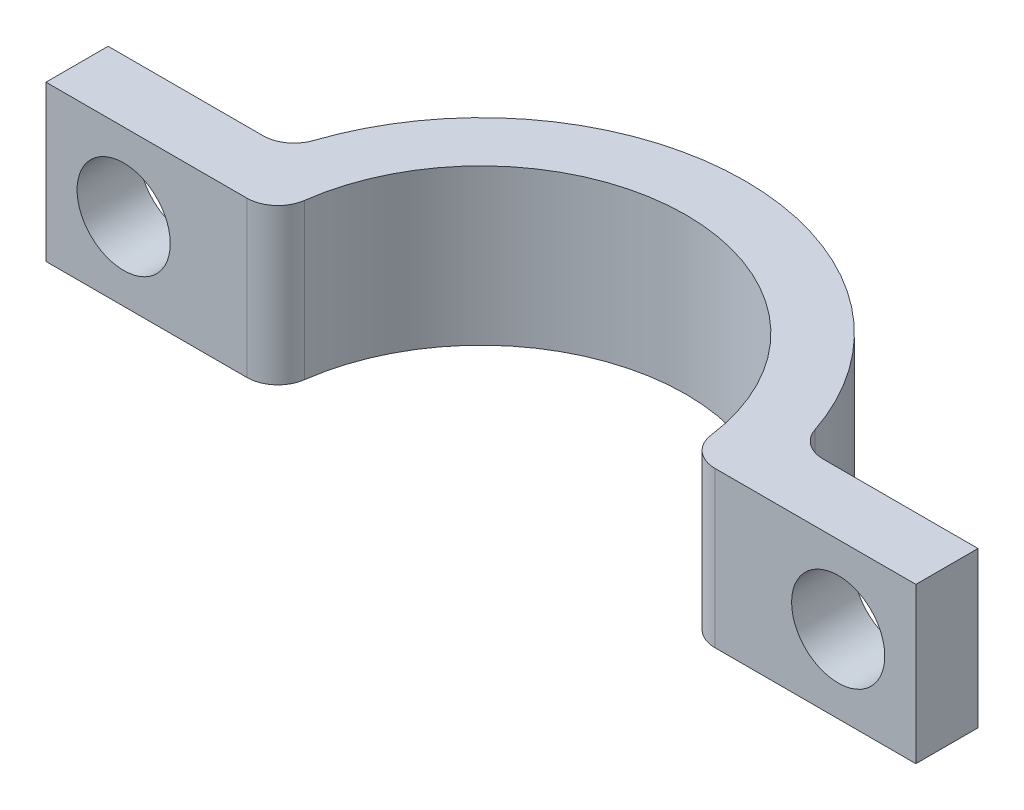
ISO-10303-21;
HEADER;
FILE_DESCRIPTION(('STEP AP214'),'2;1');
FILE_NAME('part.step','',(''),(''),'','','');
FILE_SCHEMA(('AUTOMOTIVE_DESIGN { 1 0 10303 214 1 1 1 1 }'));
ENDSEC;
DATA;
#1=APPLICATION_CONTEXT('core data for automotive mechanical design processes');
#2=APPLICATION_PROTOCOL_DEFINITION('international standard','automotive_design',2000,#1);
#3=PRODUCT_CONTEXT('',#1,'mechanical');
#4=PRODUCT('Part','Part','',(#3));
#5=PRODUCT_RELATED_PRODUCT_CATEGORY('part','',(#4));
#6=PRODUCT_DEFINITION_FORMATION('','',#4);
#7=PRODUCT_DEFINITION_CONTEXT('part definition',#1,'design');
#8=PRODUCT_DEFINITION('design','',#6,#7);
#9=PRODUCT_DEFINITION_SHAPE('','',#8);
#10=(LENGTH_UNIT() NAMED_UNIT(*) SI_UNIT(.MILLI.,.METRE.));
#11=(NAMED_UNIT(*) PLANE_ANGLE_UNIT() SI_UNIT($,.RADIAN.));
#12=(NAMED_UNIT(*) SI_UNIT($,.STERADIAN.) SOLID_ANGLE_UNIT());
#13=UNCERTAINTY_MEASURE_WITH_UNIT(LENGTH_MEASURE(1.E-05),#10,'distance_accuracy_value','');
#14=(GEOMETRIC_REPRESENTATION_CONTEXT(3) GLOBAL_UNCERTAINTY_ASSIGNED_CONTEXT((#13)) GLOBAL_UNIT_ASSIGNED_CONTEXT((#10,
#11,#12)) REPRESENTATION_CONTEXT('',''));
#15=CARTESIAN_POINT('',(0.,0.,0.));
#16=DIRECTION('',(0.,0.,1.));
#17=DIRECTION('',(1.,0.,0.));
#18=AXIS2_PLACEMENT_3D('',#15,#16,#17);
#19=CARTESIAN_POINT('',(0.,5.,0.));
#20=DIRECTION('',(0.,-1.,0.));
#21=DIRECTION('',(0.,0.,-1.));
#22=AXIS2_PLACEMENT_3D('',#19,#20,#21);
#23=CYLINDRICAL_SURFACE('',#22,6.6);
#24=CARTESIAN_POINT('',(0.,5.,0.));
#25=DIRECTION('',(0.,1.,0.));
#26=DIRECTION('',(0.,0.,1.));
#27=AXIS2_PLACEMENT_3D('',#24,#25,#26);
#28=CIRCLE('',#27,6.6);
#29=CARTESIAN_POINT('',(6.5426175859014,5.,-0.86842105263158));
#30=VERTEX_POINT('',#29);
#31=CARTESIAN_POINT('',(-6.5426175859014,5.,-0.868421052631579));
#32=VERTEX_POINT('',#31);
#33=EDGE_CURVE('E147',#30,#32,#28,.T.);
#34=ORIENTED_EDGE('',*,*,#33,.T.);
#35=DIRECTION('',(0.,-1.,0.));
#36=VECTOR('',#35,1.);
#37=CARTESIAN_POINT('',(-6.5426175859014,5.,-0.868421052631579));
#38=LINE('',#37,#36);
#39=CARTESIAN_POINT('',(-6.5426175859014,0.,-0.868421052631579));
#40=VERTEX_POINT('',#39);
#41=EDGE_CURVE('E200',#32,#40,#38,.T.);
#42=ORIENTED_EDGE('',*,*,#41,.T.);
#43=CARTESIAN_POINT('',(0.,0.,0.));
#44=DIRECTION('',(0.,1.,0.));
#45=DIRECTION('',(0.,0.,1.));
#46=AXIS2_PLACEMENT_3D('',#43,#44,#45);
#47=CIRCLE('',#46,6.6);
#48=CARTESIAN_POINT('',(6.5426175859014,0.,-0.86842105263158));
#49=VERTEX_POINT('',#48);
#50=EDGE_CURVE('E167',#49,#40,#47,.T.);
#51=ORIENTED_EDGE('',*,*,#50,.F.);
#52=DIRECTION('',(0.,-1.,0.));
#53=VECTOR('',#52,1.);
#54=CARTESIAN_POINT('',(6.5426175859014,5.,-0.86842105263158));
#55=LINE('',#54,#53);
#56=EDGE_CURVE('E198',#49,#30,#55,.F.);
#57=ORIENTED_EDGE('',*,*,#56,.T.);
#58=EDGE_LOOP('',(#34,#42,#51,#57));
#59=FACE_BOUND('',#58,.T.);
#60=ADVANCED_FACE('F35',(#59),#23,.F.);
#61=CARTESIAN_POINT('',(0.,5.,0.));
#62=DIRECTION('',(0.,0.,1.));
#63=DIRECTION('',(1.,0.,0.));
#64=AXIS2_PLACEMENT_3D('',#61,#62,#63);
#65=PLANE('',#64);
#66=CARTESIAN_POINT('',(11.5,2.5,0.));
#67=DIRECTION('',(0.,0.,-1.));
#68=DIRECTION('',(-1.,0.,0.));
#69=AXIS2_PLACEMENT_3D('',#66,#67,#68);
#70=CIRCLE('',#69,1.5);
#71=CARTESIAN_POINT('',(10.,2.5,0.));
#72=VERTEX_POINT('',#71);
#73=EDGE_CURVE('E170',#72,#72,#70,.T.);
#74=ORIENTED_EDGE('',*,*,#73,.T.);
#75=EDGE_LOOP('',(#74));
#76=FACE_BOUND('',#75,.T.);
#77=DIRECTION('',(-1.,0.,0.));
#78=VECTOR('',#77,1.);
#79=CARTESIAN_POINT('',(0.,5.,0.));
#80=LINE('',#79,#78);
#81=CARTESIAN_POINT('',(14.,5.,0.));
#82=VERTEX_POINT('',#81);
#83=CARTESIAN_POINT('',(7.53392328073495,5.,0.));
#84=VERTEX_POINT('',#83);
#85=EDGE_CURVE('E130',#82,#84,#80,.T.);
#86=ORIENTED_EDGE('',*,*,#85,.T.);
#87=DIRECTION('',(0.,-1.,0.));
#88=VECTOR('',#87,1.);
#89=CARTESIAN_POINT('',(7.53392328073495,5.,0.));
#90=LINE('',#89,#88);
#91=CARTESIAN_POINT('',(7.53392328073495,0.,0.));
#92=VERTEX_POINT('',#91);
#93=EDGE_CURVE('E212',#84,#92,#90,.T.);
#94=ORIENTED_EDGE('',*,*,#93,.T.);
#95=DIRECTION('',(-1.,0.,0.));
#96=VECTOR('',#95,1.);
#97=CARTESIAN_POINT('',(0.,0.,0.));
#98=LINE('',#97,#96);
#99=CARTESIAN_POINT('',(14.,0.,0.));
#100=VERTEX_POINT('',#99);
#101=EDGE_CURVE('E133',#100,#92,#98,.T.);
#102=ORIENTED_EDGE('',*,*,#101,.F.);
#103=DIRECTION('',(0.,-1.,0.));
#104=VECTOR('',#103,1.);
#105=CARTESIAN_POINT('',(14.,5.,0.));
#106=LINE('',#105,#104);
#107=EDGE_CURVE('E126',#82,#100,#106,.T.);
#108=ORIENTED_EDGE('',*,*,#107,.F.);
#109=EDGE_LOOP('',(#86,#94,#102,#108));
#110=FACE_BOUND('',#109,.T.);
#111=ADVANCED_FACE('F128',(#76,#110),#65,.T.);
#112=CARTESIAN_POINT('',(14.,5.,0.));
#113=DIRECTION('',(-1.,0.,0.));
#114=DIRECTION('',(0.,0.,1.));
#115=AXIS2_PLACEMENT_3D('',#112,#113,#114);
#116=PLANE('',#115);
#117=DIRECTION('',(0.,0.,-1.));
#118=VECTOR('',#117,1.);
#119=CARTESIAN_POINT('',(14.,0.,0.));
#120=LINE('',#119,#118);
#121=CARTESIAN_POINT('',(14.,0.,-2.));
#122=VERTEX_POINT('',#121);
#123=EDGE_CURVE('E172',#100,#122,#120,.T.);
#124=ORIENTED_EDGE('',*,*,#123,.T.);
#125=DIRECTION('',(0.,-1.,0.));
#126=VECTOR('',#125,1.);
#127=CARTESIAN_POINT('',(14.,5.,-2.));
#128=LINE('',#127,#126);
#129=CARTESIAN_POINT('',(14.,5.,-2.));
#130=VERTEX_POINT('',#129);
#131=EDGE_CURVE('E137',#130,#122,#128,.T.);
#132=ORIENTED_EDGE('',*,*,#131,.F.);
#133=DIRECTION('',(0.,0.,-1.));
#134=VECTOR('',#133,1.);
#135=CARTESIAN_POINT('',(14.,5.,0.));
#136=LINE('',#135,#134);
#137=EDGE_CURVE('E140',#82,#130,#136,.T.);
#138=ORIENTED_EDGE('',*,*,#137,.F.);
#139=ORIENTED_EDGE('',*,*,#107,.T.);
#140=EDGE_LOOP('',(#124,#132,#138,#139));
#141=FACE_BOUND('',#140,.T.);
#142=ADVANCED_FACE('F141',(#141),#116,.F.);
#143=CARTESIAN_POINT('',(0.,5.,-2.));
#144=DIRECTION('',(0.,0.,1.));
#145=DIRECTION('',(1.,0.,0.));
#146=AXIS2_PLACEMENT_3D('',#143,#144,#145);
#147=PLANE('',#146);
#148=CARTESIAN_POINT('',(11.5,2.5,-2.));
#149=DIRECTION('',(0.,0.,-1.));
#150=DIRECTION('',(-1.,0.,0.));
#151=AXIS2_PLACEMENT_3D('',#148,#149,#150);
#152=CIRCLE('',#151,1.5);
#153=CARTESIAN_POINT('',(10.,2.5,-2.));
#154=VERTEX_POINT('',#153);
#155=EDGE_CURVE('E406',#154,#154,#152,.T.);
#156=ORIENTED_EDGE('',*,*,#155,.F.);
#157=EDGE_LOOP('',(#156));
#158=FACE_BOUND('',#157,.T.);
#159=DIRECTION('',(-1.,0.,0.));
#160=VECTOR('',#159,1.);
#161=CARTESIAN_POINT('',(0.,0.,-2.));
#162=LINE('',#161,#160);
#163=CARTESIAN_POINT('',(9.01387818865997,0.,-2.));
#164=VERTEX_POINT('',#163);
#165=EDGE_CURVE('E174',#122,#164,#162,.T.);
#166=ORIENTED_EDGE('',*,*,#165,.T.);
#167=DIRECTION('',(0.,1.,0.));
#168=VECTOR('',#167,1.);
#169=CARTESIAN_POINT('',(9.01387818865997,5.,-2.));
#170=LINE('',#169,#168);
#171=CARTESIAN_POINT('',(9.01387818865997,5.,-2.));
#172=VERTEX_POINT('',#171);
#173=EDGE_CURVE('E50',#164,#172,#170,.T.);
#174=ORIENTED_EDGE('',*,*,#173,.T.);
#175=DIRECTION('',(-1.,0.,0.));
#176=VECTOR('',#175,1.);
#177=CARTESIAN_POINT('',(0.,5.,-2.));
#178=LINE('',#177,#176);
#179=EDGE_CURVE('E143',#130,#172,#178,.T.);
#180=ORIENTED_EDGE('',*,*,#179,.F.);
#181=ORIENTED_EDGE('',*,*,#131,.T.);
#182=EDGE_LOOP('',(#166,#174,#180,#181));
#183=FACE_BOUND('',#182,.T.);
#184=ADVANCED_FACE('F224',(#158,#183),#147,.F.);
#185=CARTESIAN_POINT('',(0.,5.,0.));
#186=DIRECTION('',(0.,-1.,0.));
#187=DIRECTION('',(0.,0.,-1.));
#188=AXIS2_PLACEMENT_3D('',#185,#186,#187);
#189=CYLINDRICAL_SURFACE('',#188,8.5);
#190=CARTESIAN_POINT('',(0.,0.,0.));
#191=DIRECTION('',(0.,1.,0.));
#192=DIRECTION('',(0.,0.,1.));
#193=AXIS2_PLACEMENT_3D('',#190,#191,#192);
#194=CIRCLE('',#193,8.5);
#195=CARTESIAN_POINT('',(8.06504890564313,0.,-2.68421052631579));
#196=VERTEX_POINT('',#195);
#197=CARTESIAN_POINT('',(-8.06504890564313,0.,-2.68421052631579));
#198=VERTEX_POINT('',#197);
#199=EDGE_CURVE('E176',#196,#198,#194,.T.);
#200=ORIENTED_EDGE('',*,*,#199,.T.);
#201=DIRECTION('',(0.,-1.,0.));
#202=VECTOR('',#201,1.);
#203=CARTESIAN_POINT('',(-8.06504890564313,5.,-2.68421052631579));
#204=LINE('',#203,#202);
#205=CARTESIAN_POINT('',(-8.06504890564313,5.,-2.68421052631579));
#206=VERTEX_POINT('',#205);
#207=EDGE_CURVE('E196',#198,#206,#204,.F.);
#208=ORIENTED_EDGE('',*,*,#207,.T.);
#209=CARTESIAN_POINT('',(0.,5.,0.));
#210=DIRECTION('',(0.,1.,0.));
#211=DIRECTION('',(0.,0.,1.));
#212=AXIS2_PLACEMENT_3D('',#209,#210,#211);
#213=CIRCLE('',#212,8.5);
#214=CARTESIAN_POINT('',(8.06504890564313,5.,-2.68421052631579));
#215=VERTEX_POINT('',#214);
#216=EDGE_CURVE('E155',#215,#206,#213,.T.);
#217=ORIENTED_EDGE('',*,*,#216,.F.);
#218=DIRECTION('',(0.,-1.,0.));
#219=VECTOR('',#218,1.);
#220=CARTESIAN_POINT('',(8.06504890564313,5.,-2.68421052631579));
#221=LINE('',#220,#219);
#222=EDGE_CURVE('E193',#215,#196,#221,.T.);
#223=ORIENTED_EDGE('',*,*,#222,.T.);
#224=EDGE_LOOP('',(#200,#208,#217,#223));
#225=FACE_BOUND('',#224,.T.);
#226=ADVANCED_FACE('F229',(#225),#189,.T.);
#227=CARTESIAN_POINT('',(0.,5.,-2.));
#228=DIRECTION('',(0.,0.,-1.));
#229=DIRECTION('',(-1.,0.,0.));
#230=AXIS2_PLACEMENT_3D('',#227,#228,#229);
#231=PLANE('',#230);
#232=CARTESIAN_POINT('',(-11.5,2.5,-2.));
#233=DIRECTION('',(0.,0.,-1.));
#234=DIRECTION('',(1.,0.,0.));
#235=AXIS2_PLACEMENT_3D('',#232,#233,#234);
#236=CIRCLE('',#235,1.5);
#237=CARTESIAN_POINT('',(-10.,2.5,-2.));
#238=VERTEX_POINT('',#237);
#239=EDGE_CURVE('E412',#238,#238,#236,.T.);
#240=ORIENTED_EDGE('',*,*,#239,.F.);
#241=EDGE_LOOP('',(#240));
#242=FACE_BOUND('',#241,.T.);
#243=DIRECTION('',(1.,0.,0.));
#244=VECTOR('',#243,1.);
#245=CARTESIAN_POINT('',(0.,5.,-2.));
#246=LINE('',#245,#244);
#247=CARTESIAN_POINT('',(-14.,5.,-2.));
#248=VERTEX_POINT('',#247);
#249=CARTESIAN_POINT('',(-9.01387818865997,5.,-2.));
#250=VERTEX_POINT('',#249);
#251=EDGE_CURVE('E158',#248,#250,#246,.T.);
#252=ORIENTED_EDGE('',*,*,#251,.T.);
#253=DIRECTION('',(0.,-1.,0.));
#254=VECTOR('',#253,1.);
#255=CARTESIAN_POINT('',(-9.01387818865997,5.,-2.));
#256=LINE('',#255,#254);
#257=CARTESIAN_POINT('',(-9.01387818865997,0.,-2.));
#258=VERTEX_POINT('',#257);
#259=EDGE_CURVE('E136',#250,#258,#256,.T.);
#260=ORIENTED_EDGE('',*,*,#259,.T.);
#261=DIRECTION('',(1.,0.,0.));
#262=VECTOR('',#261,1.);
#263=CARTESIAN_POINT('',(0.,0.,-2.));
#264=LINE('',#263,#262);
#265=CARTESIAN_POINT('',(-14.,0.,-2.));
#266=VERTEX_POINT('',#265);
#267=EDGE_CURVE('E179',#266,#258,#264,.T.);
#268=ORIENTED_EDGE('',*,*,#267,.F.);
#269=DIRECTION('',(0.,-1.,0.));
#270=VECTOR('',#269,1.);
#271=CARTESIAN_POINT('',(-14.,5.,-2.));
#272=LINE('',#271,#270);
#273=EDGE_CURVE('E188',#248,#266,#272,.T.);
#274=ORIENTED_EDGE('',*,*,#273,.F.);
#275=EDGE_LOOP('',(#252,#260,#268,#274));
#276=FACE_BOUND('',#275,.T.);
#277=ADVANCED_FACE('F237',(#242,#276),#231,.T.);
#278=CARTESIAN_POINT('',(-14.,5.,0.));
#279=DIRECTION('',(-1.,0.,0.));
#280=DIRECTION('',(0.,0.,1.));
#281=AXIS2_PLACEMENT_3D('',#278,#279,#280);
#282=PLANE('',#281);
#283=DIRECTION('',(0.,0.,-1.));
#284=VECTOR('',#283,1.);
#285=CARTESIAN_POINT('',(-14.,0.,0.));
#286=LINE('',#285,#284);
#287=CARTESIAN_POINT('',(-14.,0.,0.));
#288=VERTEX_POINT('',#287);
#289=EDGE_CURVE('E182',#288,#266,#286,.T.);
#290=ORIENTED_EDGE('',*,*,#289,.F.);
#291=DIRECTION('',(0.,-1.,0.));
#292=VECTOR('',#291,1.);
#293=CARTESIAN_POINT('',(-14.,5.,0.));
#294=LINE('',#293,#292);
#295=CARTESIAN_POINT('',(-14.,5.,0.));
#296=VERTEX_POINT('',#295);
#297=EDGE_CURVE('E166',#296,#288,#294,.T.);
#298=ORIENTED_EDGE('',*,*,#297,.F.);
#299=DIRECTION('',(0.,0.,-1.));
#300=VECTOR('',#299,1.);
#301=CARTESIAN_POINT('',(-14.,5.,0.));
#302=LINE('',#301,#300);
#303=EDGE_CURVE('E161',#296,#248,#302,.T.);
#304=ORIENTED_EDGE('',*,*,#303,.T.);
#305=ORIENTED_EDGE('',*,*,#273,.T.);
#306=EDGE_LOOP('',(#290,#298,#304,#305));
#307=FACE_BOUND('',#306,.T.);
#308=ADVANCED_FACE('F241',(#307),#282,.T.);
#309=CARTESIAN_POINT('',(0.,5.,0.));
#310=DIRECTION('',(0.,0.,1.));
#311=DIRECTION('',(1.,0.,0.));
#312=AXIS2_PLACEMENT_3D('',#309,#310,#311);
#313=PLANE('',#312);
#314=CARTESIAN_POINT('',(-11.5,2.5,0.));
#315=DIRECTION('',(0.,0.,-1.));
#316=DIRECTION('',(1.,0.,0.));
#317=AXIS2_PLACEMENT_3D('',#314,#315,#316);
#318=CIRCLE('',#317,1.5);
#319=CARTESIAN_POINT('',(-10.,2.5,0.));
#320=VERTEX_POINT('',#319);
#321=EDGE_CURVE('E408',#320,#320,#318,.T.);
#322=ORIENTED_EDGE('',*,*,#321,.T.);
#323=EDGE_LOOP('',(#322));
#324=FACE_BOUND('',#323,.T.);
#325=DIRECTION('',(-1.,0.,0.));
#326=VECTOR('',#325,1.);
#327=CARTESIAN_POINT('',(0.,0.,0.));
#328=LINE('',#327,#326);
#329=CARTESIAN_POINT('',(-7.53392328073495,0.,0.));
#330=VERTEX_POINT('',#329);
#331=EDGE_CURVE('E150',#330,#288,#328,.T.);
#332=ORIENTED_EDGE('',*,*,#331,.F.);
#333=DIRECTION('',(0.,-1.,0.));
#334=VECTOR('',#333,1.);
#335=CARTESIAN_POINT('',(-7.53392328073495,5.,0.));
#336=LINE('',#335,#334);
#337=CARTESIAN_POINT('',(-7.53392328073495,5.,0.));
#338=VERTEX_POINT('',#337);
#339=EDGE_CURVE('E207',#330,#338,#336,.F.);
#340=ORIENTED_EDGE('',*,*,#339,.T.);
#341=DIRECTION('',(-1.,0.,0.));
#342=VECTOR('',#341,1.);
#343=CARTESIAN_POINT('',(0.,5.,0.));
#344=LINE('',#343,#342);
#345=EDGE_CURVE('E164',#338,#296,#344,.T.);
#346=ORIENTED_EDGE('',*,*,#345,.T.);
#347=ORIENTED_EDGE('',*,*,#297,.T.);
#348=EDGE_LOOP('',(#332,#340,#346,#347));
#349=FACE_BOUND('',#348,.T.);
#350=ADVANCED_FACE('F288',(#324,#349),#313,.T.);
#351=CARTESIAN_POINT('',(0.,5.,0.));
#352=DIRECTION('',(0.,1.,0.));
#353=DIRECTION('',(0.,0.,1.));
#354=AXIS2_PLACEMENT_3D('',#351,#352,#353);
#355=PLANE('',#354);
#356=ORIENTED_EDGE('',*,*,#345,.F.);
#357=CARTESIAN_POINT('',(-7.53392328073495,5.,-1.));
#358=DIRECTION('',(0.,1.,0.));
#359=DIRECTION('',(0.,0.,1.));
#360=AXIS2_PLACEMENT_3D('',#357,#358,#359);
#361=CIRCLE('',#360,1.);
#362=EDGE_CURVE('E210',#338,#32,#361,.T.);
#363=ORIENTED_EDGE('',*,*,#362,.T.);
#364=ORIENTED_EDGE('',*,*,#33,.F.);
#365=CARTESIAN_POINT('',(7.53392328073495,5.,-1.));
#366=DIRECTION('',(0.,1.,0.));
#367=DIRECTION('',(0.,0.,1.));
#368=AXIS2_PLACEMENT_3D('',#365,#366,#367);
#369=CIRCLE('',#368,1.);
#370=EDGE_CURVE('E58',#30,#84,#369,.T.);
#371=ORIENTED_EDGE('',*,*,#370,.T.);
#372=ORIENTED_EDGE('',*,*,#85,.F.);
#373=ORIENTED_EDGE('',*,*,#137,.T.);
#374=ORIENTED_EDGE('',*,*,#179,.T.);
#375=CARTESIAN_POINT('',(9.01387818865997,5.,-3.));
#376=DIRECTION('',(0.,1.,0.));
#377=DIRECTION('',(0.,0.,1.));
#378=AXIS2_PLACEMENT_3D('',#375,#376,#377);
#379=CIRCLE('',#378,1.);
#380=EDGE_CURVE('E11',#172,#215,#379,.F.);
#381=ORIENTED_EDGE('',*,*,#380,.T.);
#382=ORIENTED_EDGE('',*,*,#216,.T.);
#383=CARTESIAN_POINT('',(-9.01387818865997,5.,-3.));
#384=DIRECTION('',(0.,1.,0.));
#385=DIRECTION('',(0.,0.,1.));
#386=AXIS2_PLACEMENT_3D('',#383,#384,#385);
#387=CIRCLE('',#386,1.);
#388=EDGE_CURVE('E217',#206,#250,#387,.F.);
#389=ORIENTED_EDGE('',*,*,#388,.T.);
#390=ORIENTED_EDGE('',*,*,#251,.F.);
#391=ORIENTED_EDGE('',*,*,#303,.F.);
#392=EDGE_LOOP('',(#356,#363,#364,#371,#372,#373,#374,#381,#382,#389,#390,#391));
#393=FACE_BOUND('',#392,.T.);
#394=ADVANCED_FACE('F146',(#393),#355,.T.);
#395=CARTESIAN_POINT('',(0.,0.,0.));
#396=DIRECTION('',(0.,1.,0.));
#397=DIRECTION('',(0.,0.,1.));
#398=AXIS2_PLACEMENT_3D('',#395,#396,#397);
#399=PLANE('',#398);
#400=ORIENTED_EDGE('',*,*,#50,.T.);
#401=CARTESIAN_POINT('',(-7.53392328073495,0.,-1.));
#402=DIRECTION('',(0.,1.,0.));
#403=DIRECTION('',(0.,0.,1.));
#404=AXIS2_PLACEMENT_3D('',#401,#402,#403);
#405=CIRCLE('',#404,1.);
#406=EDGE_CURVE('E205',#40,#330,#405,.F.);
#407=ORIENTED_EDGE('',*,*,#406,.T.);
#408=ORIENTED_EDGE('',*,*,#331,.T.);
#409=ORIENTED_EDGE('',*,*,#289,.T.);
#410=ORIENTED_EDGE('',*,*,#267,.T.);
#411=CARTESIAN_POINT('',(-9.01387818865997,0.,-3.));
#412=DIRECTION('',(0.,1.,0.));
#413=DIRECTION('',(0.,0.,1.));
#414=AXIS2_PLACEMENT_3D('',#411,#412,#413);
#415=CIRCLE('',#414,1.);
#416=EDGE_CURVE('E215',#258,#198,#415,.T.);
#417=ORIENTED_EDGE('',*,*,#416,.T.);
#418=ORIENTED_EDGE('',*,*,#199,.F.);
#419=CARTESIAN_POINT('',(9.01387818865997,0.,-3.));
#420=DIRECTION('',(0.,1.,0.));
#421=DIRECTION('',(0.,0.,1.));
#422=AXIS2_PLACEMENT_3D('',#419,#420,#421);
#423=CIRCLE('',#422,1.);
#424=EDGE_CURVE('E43',#196,#164,#423,.T.);
#425=ORIENTED_EDGE('',*,*,#424,.T.);
#426=ORIENTED_EDGE('',*,*,#165,.F.);
#427=ORIENTED_EDGE('',*,*,#123,.F.);
#428=ORIENTED_EDGE('',*,*,#101,.T.);
#429=CARTESIAN_POINT('',(7.53392328073495,0.,-1.));
#430=DIRECTION('',(0.,1.,0.));
#431=DIRECTION('',(0.,0.,1.));
#432=AXIS2_PLACEMENT_3D('',#429,#430,#431);
#433=CIRCLE('',#432,1.);
#434=EDGE_CURVE('E203',#92,#49,#433,.F.);
#435=ORIENTED_EDGE('',*,*,#434,.T.);
#436=EDGE_LOOP('',(#400,#407,#408,#409,#410,#417,#418,#425,#426,#427,#428,#435));
#437=FACE_BOUND('',#436,.T.);
#438=ADVANCED_FACE('F221',(#437),#399,.F.);
#439=CARTESIAN_POINT('',(11.5,2.5,0.));
#440=DIRECTION('',(0.,0.,-1.));
#441=DIRECTION('',(-1.,0.,0.));
#442=AXIS2_PLACEMENT_3D('',#439,#440,#441);
#443=CYLINDRICAL_SURFACE('',#442,1.5);
#444=ORIENTED_EDGE('',*,*,#73,.F.);
#445=EDGE_LOOP('',(#444));
#446=FACE_BOUND('',#445,.T.);
#447=ORIENTED_EDGE('',*,*,#155,.T.);
#448=EDGE_LOOP('',(#447));
#449=FACE_BOUND('',#448,.T.);
#450=ADVANCED_FACE('F275',(#446,#449),#443,.F.);
#451=CARTESIAN_POINT('',(-11.5,2.5,0.));
#452=DIRECTION('',(0.,0.,-1.));
#453=DIRECTION('',(-1.,0.,0.));
#454=AXIS2_PLACEMENT_3D('',#451,#452,#453);
#455=CYLINDRICAL_SURFACE('',#454,1.5);
#456=ORIENTED_EDGE('',*,*,#321,.F.);
#457=EDGE_LOOP('',(#456));
#458=FACE_BOUND('',#457,.T.);
#459=ORIENTED_EDGE('',*,*,#239,.T.);
#460=EDGE_LOOP('',(#459));
#461=FACE_BOUND('',#460,.T.);
#462=ADVANCED_FACE('F271',(#458,#461),#455,.F.);
#463=CARTESIAN_POINT('',(-9.01387818865997,5.,-3.));
#464=DIRECTION('',(0.,-1.,0.));
#465=DIRECTION('',(0.,0.,-1.));
#466=AXIS2_PLACEMENT_3D('',#463,#464,#465);
#467=CYLINDRICAL_SURFACE('',#466,1.);
#468=ORIENTED_EDGE('',*,*,#388,.F.);
#469=ORIENTED_EDGE('',*,*,#207,.F.);
#470=ORIENTED_EDGE('',*,*,#416,.F.);
#471=ORIENTED_EDGE('',*,*,#259,.F.);
#472=EDGE_LOOP('',(#468,#469,#470,#471));
#473=FACE_BOUND('',#472,.T.);
#474=ADVANCED_FACE('F232',(#473),#467,.F.);
#475=CARTESIAN_POINT('',(-7.53392328073495,5.,-1.));
#476=DIRECTION('',(0.,-1.,0.));
#477=DIRECTION('',(0.,0.,-1.));
#478=AXIS2_PLACEMENT_3D('',#475,#476,#477);
#479=CYLINDRICAL_SURFACE('',#478,1.);
#480=ORIENTED_EDGE('',*,*,#362,.F.);
#481=ORIENTED_EDGE('',*,*,#339,.F.);
#482=ORIENTED_EDGE('',*,*,#406,.F.);
#483=ORIENTED_EDGE('',*,*,#41,.F.);
#484=EDGE_LOOP('',(#480,#481,#482,#483));
#485=FACE_BOUND('',#484,.T.);
#486=ADVANCED_FACE('F248',(#485),#479,.T.);
#487=CARTESIAN_POINT('',(7.53392328073495,5.,-1.));
#488=DIRECTION('',(0.,-1.,0.));
#489=DIRECTION('',(0.,0.,-1.));
#490=AXIS2_PLACEMENT_3D('',#487,#488,#489);
#491=CYLINDRICAL_SURFACE('',#490,1.);
#492=ORIENTED_EDGE('',*,*,#370,.F.);
#493=ORIENTED_EDGE('',*,*,#56,.F.);
#494=ORIENTED_EDGE('',*,*,#434,.F.);
#495=ORIENTED_EDGE('',*,*,#93,.F.);
#496=EDGE_LOOP('',(#492,#493,#494,#495));
#497=FACE_BOUND('',#496,.T.);
#498=ADVANCED_FACE('F254',(#497),#491,.T.);
#499=CARTESIAN_POINT('',(9.01387818865997,5.,-3.));
#500=DIRECTION('',(0.,-1.,0.));
#501=DIRECTION('',(0.,0.,-1.));
#502=AXIS2_PLACEMENT_3D('',#499,#500,#501);
#503=CYLINDRICAL_SURFACE('',#502,1.);
#504=ORIENTED_EDGE('',*,*,#380,.F.);
#505=ORIENTED_EDGE('',*,*,#173,.F.);
#506=ORIENTED_EDGE('',*,*,#424,.F.);
#507=ORIENTED_EDGE('',*,*,#222,.F.);
#508=EDGE_LOOP('',(#504,#505,#506,#507));
#509=FACE_BOUND('',#508,.T.);
#510=ADVANCED_FACE('F37',(#509),#503,.F.);
#511=CLOSED_SHELL('',(#60,#111,#142,#184,#226,#277,#308,#350,#394,#438,#450,#462,#474,#486,#498,#510));
#512=MANIFOLD_SOLID_BREP('B2',#511);
#513=ADVANCED_BREP_SHAPE_REPRESENTATION('',(#18,#512),#14);
#514=SHAPE_DEFINITION_REPRESENTATION(#9,#513);
ENDSEC;
END-ISO-10303-21;
